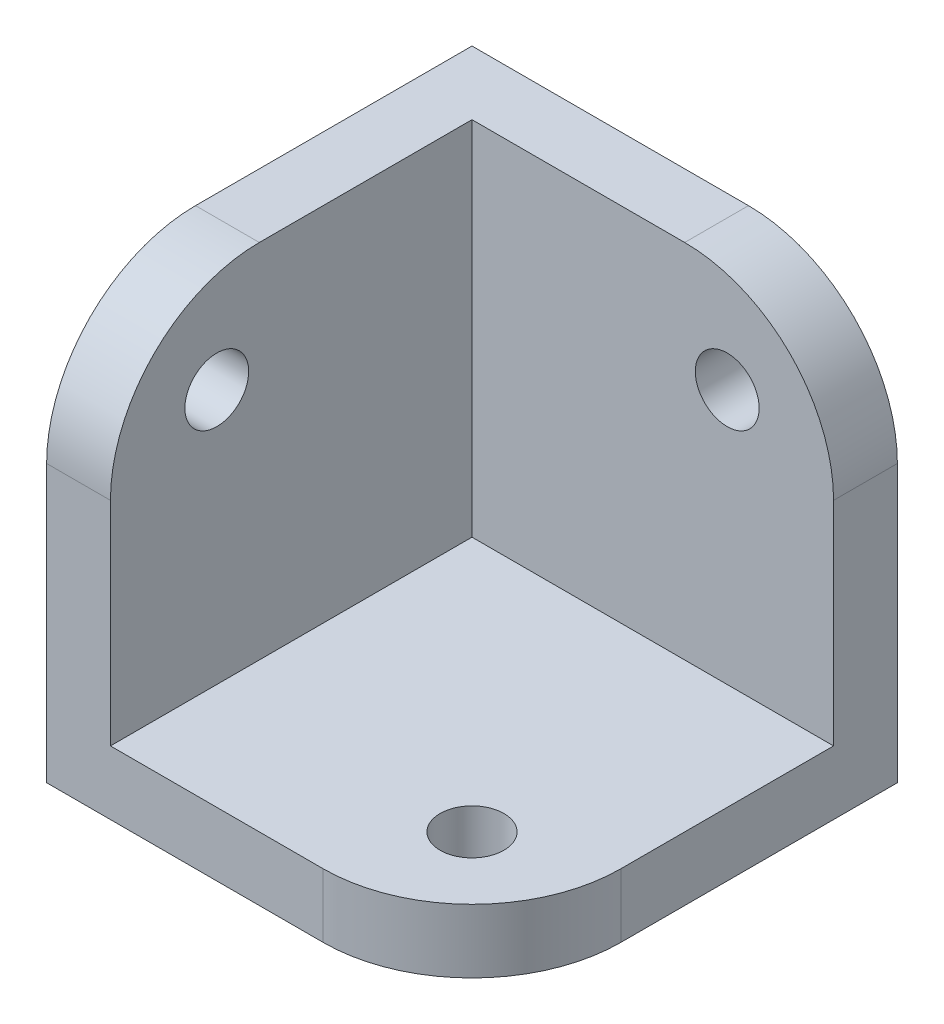
ISO-10303-21;
HEADER;
FILE_DESCRIPTION(('STEP AP214'),'2;1');
FILE_NAME('part.step','',(''),(''),'','','');
FILE_SCHEMA(('AUTOMOTIVE_DESIGN { 1 0 10303 214 1 1 1 1 }'));
ENDSEC;
DATA;
#1=APPLICATION_CONTEXT('core data for automotive mechanical design processes');
#2=APPLICATION_PROTOCOL_DEFINITION('international standard','automotive_design',2000,#1);
#3=PRODUCT_CONTEXT('',#1,'mechanical');
#4=PRODUCT('Part','Part','',(#3));
#5=PRODUCT_RELATED_PRODUCT_CATEGORY('part','',(#4));
#6=PRODUCT_DEFINITION_FORMATION('','',#4);
#7=PRODUCT_DEFINITION_CONTEXT('part definition',#1,'design');
#8=PRODUCT_DEFINITION('design','',#6,#7);
#9=PRODUCT_DEFINITION_SHAPE('','',#8);
#10=(LENGTH_UNIT() NAMED_UNIT(*) SI_UNIT(.MILLI.,.METRE.));
#11=(NAMED_UNIT(*) PLANE_ANGLE_UNIT() SI_UNIT($,.RADIAN.));
#12=(NAMED_UNIT(*) SI_UNIT($,.STERADIAN.) SOLID_ANGLE_UNIT());
#13=UNCERTAINTY_MEASURE_WITH_UNIT(LENGTH_MEASURE(1.E-05),#10,'distance_accuracy_value','');
#14=(GEOMETRIC_REPRESENTATION_CONTEXT(3) GLOBAL_UNCERTAINTY_ASSIGNED_CONTEXT((#13)) GLOBAL_UNIT_ASSIGNED_CONTEXT((#10,
#11,#12)) REPRESENTATION_CONTEXT('',''));
#15=CARTESIAN_POINT('',(0.,0.,0.));
#16=DIRECTION('',(0.,0.,1.));
#17=DIRECTION('',(1.,0.,0.));
#18=AXIS2_PLACEMENT_3D('',#15,#16,#17);
#19=CARTESIAN_POINT('',(0.,20.,3.));
#20=DIRECTION('',(1.,0.,0.));
#21=DIRECTION('',(0.,0.,-1.));
#22=AXIS2_PLACEMENT_3D('',#19,#20,#21);
#23=PLANE('',#22);
#24=CARTESIAN_POINT('',(0.,15.,15.));
#25=DIRECTION('',(-1.,0.,0.));
#26=DIRECTION('',(0.,0.,1.));
#27=AXIS2_PLACEMENT_3D('',#24,#25,#26);
#28=CIRCLE('',#27,1.5);
#29=CARTESIAN_POINT('',(0.,15.,16.5));
#30=VERTEX_POINT('',#29);
#31=EDGE_CURVE('E176',#30,#30,#28,.T.);
#32=ORIENTED_EDGE('',*,*,#31,.F.);
#33=EDGE_LOOP('',(#32));
#34=FACE_BOUND('',#33,.T.);
#35=DIRECTION('',(0.,-1.,0.));
#36=VECTOR('',#35,1.);
#37=CARTESIAN_POINT('',(0.,0.,20.));
#38=LINE('',#37,#36);
#39=CARTESIAN_POINT('',(0.,13.,20.));
#40=VERTEX_POINT('',#39);
#41=CARTESIAN_POINT('',(0.,0.,20.));
#42=VERTEX_POINT('',#41);
#43=EDGE_CURVE('E112',#40,#42,#38,.T.);
#44=ORIENTED_EDGE('',*,*,#43,.F.);
#45=CARTESIAN_POINT('',(0.,13.,13.));
#46=DIRECTION('',(1.,0.,0.));
#47=DIRECTION('',(0.,0.,-1.));
#48=AXIS2_PLACEMENT_3D('',#45,#46,#47);
#49=CIRCLE('',#48,7.);
#50=CARTESIAN_POINT('',(0.,20.,13.));
#51=VERTEX_POINT('',#50);
#52=EDGE_CURVE('E192',#40,#51,#49,.F.);
#53=ORIENTED_EDGE('',*,*,#52,.T.);
#54=DIRECTION('',(0.,0.,-1.));
#55=VECTOR('',#54,1.);
#56=CARTESIAN_POINT('',(0.,20.,3.));
#57=LINE('',#56,#55);
#58=CARTESIAN_POINT('',(0.,20.,0.));
#59=VERTEX_POINT('',#58);
#60=EDGE_CURVE('E164',#51,#59,#57,.T.);
#61=ORIENTED_EDGE('',*,*,#60,.T.);
#62=DIRECTION('',(0.,-1.,0.));
#63=VECTOR('',#62,1.);
#64=CARTESIAN_POINT('',(0.,20.,0.));
#65=LINE('',#64,#63);
#66=CARTESIAN_POINT('',(0.,0.,0.));
#67=VERTEX_POINT('',#66);
#68=EDGE_CURVE('E130',#59,#67,#65,.T.);
#69=ORIENTED_EDGE('',*,*,#68,.T.);
#70=DIRECTION('',(0.,0.,-1.));
#71=VECTOR('',#70,1.);
#72=CARTESIAN_POINT('',(0.,0.,3.));
#73=LINE('',#72,#71);
#74=EDGE_CURVE('E127',#42,#67,#73,.T.);
#75=ORIENTED_EDGE('',*,*,#74,.F.);
#76=EDGE_LOOP('',(#44,#53,#61,#69,#75));
#77=FACE_BOUND('',#76,.T.);
#78=ADVANCED_FACE('F33',(#34,#77),#23,.F.);
#79=CARTESIAN_POINT('',(0.,0.,3.));
#80=DIRECTION('',(0.,1.,0.));
#81=DIRECTION('',(0.,0.,1.));
#82=AXIS2_PLACEMENT_3D('',#79,#80,#81);
#83=PLANE('',#82);
#84=CARTESIAN_POINT('',(15.,0.,15.));
#85=DIRECTION('',(0.,-1.,0.));
#86=DIRECTION('',(0.,0.,-1.));
#87=AXIS2_PLACEMENT_3D('',#84,#85,#86);
#88=CIRCLE('',#87,1.5);
#89=CARTESIAN_POINT('',(15.,0.,13.5));
#90=VERTEX_POINT('',#89);
#91=EDGE_CURVE('E181',#90,#90,#88,.T.);
#92=ORIENTED_EDGE('',*,*,#91,.F.);
#93=EDGE_LOOP('',(#92));
#94=FACE_BOUND('',#93,.T.);
#95=DIRECTION('',(0.,0.,-1.));
#96=VECTOR('',#95,1.);
#97=CARTESIAN_POINT('',(20.,0.,3.));
#98=LINE('',#97,#96);
#99=CARTESIAN_POINT('',(20.,0.,13.));
#100=VERTEX_POINT('',#99);
#101=CARTESIAN_POINT('',(20.,0.,0.));
#102=VERTEX_POINT('',#101);
#103=EDGE_CURVE('E133',#100,#102,#98,.T.);
#104=ORIENTED_EDGE('',*,*,#103,.F.);
#105=CARTESIAN_POINT('',(13.,0.,13.));
#106=DIRECTION('',(0.,1.,0.));
#107=DIRECTION('',(0.,0.,1.));
#108=AXIS2_PLACEMENT_3D('',#105,#106,#107);
#109=CIRCLE('',#108,7.);
#110=CARTESIAN_POINT('',(13.,0.,20.));
#111=VERTEX_POINT('',#110);
#112=EDGE_CURVE('E138',#100,#111,#109,.F.);
#113=ORIENTED_EDGE('',*,*,#112,.T.);
#114=DIRECTION('',(1.,0.,0.));
#115=VECTOR('',#114,1.);
#116=CARTESIAN_POINT('',(20.,0.,20.));
#117=LINE('',#116,#115);
#118=EDGE_CURVE('E117',#42,#111,#117,.T.);
#119=ORIENTED_EDGE('',*,*,#118,.F.);
#120=ORIENTED_EDGE('',*,*,#74,.T.);
#121=DIRECTION('',(1.,0.,0.));
#122=VECTOR('',#121,1.);
#123=CARTESIAN_POINT('',(0.,0.,0.));
#124=LINE('',#123,#122);
#125=EDGE_CURVE('E166',#67,#102,#124,.T.);
#126=ORIENTED_EDGE('',*,*,#125,.T.);
#127=EDGE_LOOP('',(#104,#113,#119,#120,#126));
#128=FACE_BOUND('',#127,.T.);
#129=ADVANCED_FACE('F136',(#94,#128),#83,.F.);
#130=CARTESIAN_POINT('',(20.,0.,3.));
#131=DIRECTION('',(-1.,0.,0.));
#132=DIRECTION('',(0.,0.,1.));
#133=AXIS2_PLACEMENT_3D('',#130,#131,#132);
#134=PLANE('',#133);
#135=DIRECTION('',(0.,0.,-1.));
#136=VECTOR('',#135,1.);
#137=CARTESIAN_POINT('',(20.,3.,20.));
#138=LINE('',#137,#136);
#139=CARTESIAN_POINT('',(20.,3.,13.));
#140=VERTEX_POINT('',#139);
#141=CARTESIAN_POINT('',(20.,3.,3.));
#142=VERTEX_POINT('',#141);
#143=EDGE_CURVE('E157',#140,#142,#138,.T.);
#144=ORIENTED_EDGE('',*,*,#143,.F.);
#145=DIRECTION('',(0.,1.,0.));
#146=VECTOR('',#145,1.);
#147=CARTESIAN_POINT('',(20.,0.,13.));
#148=LINE('',#147,#146);
#149=EDGE_CURVE('E189',#140,#100,#148,.F.);
#150=ORIENTED_EDGE('',*,*,#149,.T.);
#151=ORIENTED_EDGE('',*,*,#103,.T.);
#152=DIRECTION('',(0.,1.,0.));
#153=VECTOR('',#152,1.);
#154=CARTESIAN_POINT('',(20.,0.,0.));
#155=LINE('',#154,#153);
#156=CARTESIAN_POINT('',(20.,13.,0.));
#157=VERTEX_POINT('',#156);
#158=EDGE_CURVE('E168',#102,#157,#155,.T.);
#159=ORIENTED_EDGE('',*,*,#158,.T.);
#160=DIRECTION('',(0.,0.,-1.));
#161=VECTOR('',#160,1.);
#162=CARTESIAN_POINT('',(20.,13.,3.));
#163=LINE('',#162,#161);
#164=CARTESIAN_POINT('',(20.,13.,3.));
#165=VERTEX_POINT('',#164);
#166=EDGE_CURVE('E187',#157,#165,#163,.F.);
#167=ORIENTED_EDGE('',*,*,#166,.T.);
#168=DIRECTION('',(0.,1.,0.));
#169=VECTOR('',#168,1.);
#170=CARTESIAN_POINT('',(20.,0.,3.));
#171=LINE('',#170,#169);
#172=EDGE_CURVE('E159',#142,#165,#171,.T.);
#173=ORIENTED_EDGE('',*,*,#172,.F.);
#174=EDGE_LOOP('',(#144,#150,#151,#159,#167,#173));
#175=FACE_BOUND('',#174,.T.);
#176=ADVANCED_FACE('F208',(#175),#134,.F.);
#177=CARTESIAN_POINT('',(20.,20.,3.));
#178=DIRECTION('',(0.,-1.,0.));
#179=DIRECTION('',(0.,0.,-1.));
#180=AXIS2_PLACEMENT_3D('',#177,#178,#179);
#181=PLANE('',#180);
#182=ORIENTED_EDGE('',*,*,#60,.F.);
#183=DIRECTION('',(-1.,0.,0.));
#184=VECTOR('',#183,1.);
#185=CARTESIAN_POINT('',(20.,20.,13.));
#186=LINE('',#185,#184);
#187=CARTESIAN_POINT('',(3.,20.,13.));
#188=VERTEX_POINT('',#187);
#189=EDGE_CURVE('E54',#51,#188,#186,.F.);
#190=ORIENTED_EDGE('',*,*,#189,.T.);
#191=DIRECTION('',(0.,0.,-1.));
#192=VECTOR('',#191,1.);
#193=CARTESIAN_POINT('',(3.,20.,20.));
#194=LINE('',#193,#192);
#195=CARTESIAN_POINT('',(3.,20.,3.));
#196=VERTEX_POINT('',#195);
#197=EDGE_CURVE('E146',#188,#196,#194,.T.);
#198=ORIENTED_EDGE('',*,*,#197,.T.);
#199=DIRECTION('',(-1.,0.,0.));
#200=VECTOR('',#199,1.);
#201=CARTESIAN_POINT('',(20.,20.,3.));
#202=LINE('',#201,#200);
#203=CARTESIAN_POINT('',(13.,20.,3.));
#204=VERTEX_POINT('',#203);
#205=EDGE_CURVE('E161',#204,#196,#202,.T.);
#206=ORIENTED_EDGE('',*,*,#205,.F.);
#207=DIRECTION('',(0.,0.,-1.));
#208=VECTOR('',#207,1.);
#209=CARTESIAN_POINT('',(13.,20.,3.));
#210=LINE('',#209,#208);
#211=CARTESIAN_POINT('',(13.,20.,0.));
#212=VERTEX_POINT('',#211);
#213=EDGE_CURVE('E194',#204,#212,#210,.T.);
#214=ORIENTED_EDGE('',*,*,#213,.T.);
#215=DIRECTION('',(-1.,0.,0.));
#216=VECTOR('',#215,1.);
#217=CARTESIAN_POINT('',(20.,20.,0.));
#218=LINE('',#217,#216);
#219=EDGE_CURVE('E162',#212,#59,#218,.T.);
#220=ORIENTED_EDGE('',*,*,#219,.T.);
#221=EDGE_LOOP('',(#182,#190,#198,#206,#214,#220));
#222=FACE_BOUND('',#221,.T.);
#223=ADVANCED_FACE('F210',(#222),#181,.F.);
#224=CARTESIAN_POINT('',(0.,0.,3.));
#225=DIRECTION('',(0.,0.,1.));
#226=DIRECTION('',(1.,0.,0.));
#227=AXIS2_PLACEMENT_3D('',#224,#225,#226);
#228=PLANE('',#227);
#229=CARTESIAN_POINT('',(15.,15.,3.));
#230=DIRECTION('',(0.,0.,1.));
#231=DIRECTION('',(1.,0.,0.));
#232=AXIS2_PLACEMENT_3D('',#229,#230,#231);
#233=CIRCLE('',#232,1.5);
#234=CARTESIAN_POINT('',(16.5,15.,3.));
#235=VERTEX_POINT('',#234);
#236=EDGE_CURVE('E275',#235,#235,#233,.T.);
#237=ORIENTED_EDGE('',*,*,#236,.F.);
#238=EDGE_LOOP('',(#237));
#239=FACE_BOUND('',#238,.T.);
#240=ORIENTED_EDGE('',*,*,#172,.T.);
#241=CARTESIAN_POINT('',(13.,13.,3.));
#242=DIRECTION('',(0.,0.,1.));
#243=DIRECTION('',(1.,0.,0.));
#244=AXIS2_PLACEMENT_3D('',#241,#242,#243);
#245=CIRCLE('',#244,7.);
#246=EDGE_CURVE('E11',#165,#204,#245,.T.);
#247=ORIENTED_EDGE('',*,*,#246,.T.);
#248=ORIENTED_EDGE('',*,*,#205,.T.);
#249=DIRECTION('',(0.,1.,0.));
#250=VECTOR('',#249,1.);
#251=CARTESIAN_POINT('',(3.,20.,3.));
#252=LINE('',#251,#250);
#253=CARTESIAN_POINT('',(3.,3.,3.));
#254=VERTEX_POINT('',#253);
#255=EDGE_CURVE('E123',#254,#196,#252,.T.);
#256=ORIENTED_EDGE('',*,*,#255,.F.);
#257=DIRECTION('',(-1.,0.,0.));
#258=VECTOR('',#257,1.);
#259=CARTESIAN_POINT('',(3.,3.,3.));
#260=LINE('',#259,#258);
#261=EDGE_CURVE('E147',#142,#254,#260,.T.);
#262=ORIENTED_EDGE('',*,*,#261,.F.);
#263=EDGE_LOOP('',(#240,#247,#248,#256,#262));
#264=FACE_BOUND('',#263,.T.);
#265=ADVANCED_FACE('F211',(#239,#264),#228,.T.);
#266=CARTESIAN_POINT('',(0.,0.,0.));
#267=DIRECTION('',(0.,0.,1.));
#268=DIRECTION('',(1.,0.,0.));
#269=AXIS2_PLACEMENT_3D('',#266,#267,#268);
#270=PLANE('',#269);
#271=CARTESIAN_POINT('',(15.,15.,0.));
#272=DIRECTION('',(0.,0.,-1.));
#273=DIRECTION('',(-1.,0.,0.));
#274=AXIS2_PLACEMENT_3D('',#271,#272,#273);
#275=CIRCLE('',#274,1.5);
#276=CARTESIAN_POINT('',(13.5,15.,0.));
#277=VERTEX_POINT('',#276);
#278=EDGE_CURVE('E180',#277,#277,#275,.T.);
#279=ORIENTED_EDGE('',*,*,#278,.F.);
#280=EDGE_LOOP('',(#279));
#281=FACE_BOUND('',#280,.T.);
#282=ORIENTED_EDGE('',*,*,#219,.F.);
#283=CARTESIAN_POINT('',(13.,13.,0.));
#284=DIRECTION('',(0.,0.,1.));
#285=DIRECTION('',(1.,0.,0.));
#286=AXIS2_PLACEMENT_3D('',#283,#284,#285);
#287=CIRCLE('',#286,7.);
#288=EDGE_CURVE('E41',#212,#157,#287,.F.);
#289=ORIENTED_EDGE('',*,*,#288,.T.);
#290=ORIENTED_EDGE('',*,*,#158,.F.);
#291=ORIENTED_EDGE('',*,*,#125,.F.);
#292=ORIENTED_EDGE('',*,*,#68,.F.);
#293=EDGE_LOOP('',(#282,#289,#290,#291,#292));
#294=FACE_BOUND('',#293,.T.);
#295=ADVANCED_FACE('F202',(#281,#294),#270,.F.);
#296=CARTESIAN_POINT('',(3.,3.,20.));
#297=DIRECTION('',(0.,-1.,0.));
#298=DIRECTION('',(0.,0.,-1.));
#299=AXIS2_PLACEMENT_3D('',#296,#297,#298);
#300=PLANE('',#299);
#301=CARTESIAN_POINT('',(15.,3.,15.));
#302=DIRECTION('',(0.,-1.,0.));
#303=DIRECTION('',(0.,0.,-1.));
#304=AXIS2_PLACEMENT_3D('',#301,#302,#303);
#305=CIRCLE('',#304,1.5);
#306=CARTESIAN_POINT('',(15.,3.,13.5));
#307=VERTEX_POINT('',#306);
#308=EDGE_CURVE('E177',#307,#307,#305,.T.);
#309=ORIENTED_EDGE('',*,*,#308,.T.);
#310=EDGE_LOOP('',(#309));
#311=FACE_BOUND('',#310,.T.);
#312=DIRECTION('',(-1.,0.,0.));
#313=VECTOR('',#312,1.);
#314=CARTESIAN_POINT('',(3.,3.,20.));
#315=LINE('',#314,#313);
#316=CARTESIAN_POINT('',(13.,3.,20.));
#317=VERTEX_POINT('',#316);
#318=CARTESIAN_POINT('',(3.,3.,20.));
#319=VERTEX_POINT('',#318);
#320=EDGE_CURVE('E139',#317,#319,#315,.T.);
#321=ORIENTED_EDGE('',*,*,#320,.F.);
#322=CARTESIAN_POINT('',(13.,3.,13.));
#323=DIRECTION('',(0.,-1.,0.));
#324=DIRECTION('',(0.,0.,-1.));
#325=AXIS2_PLACEMENT_3D('',#322,#323,#324);
#326=CIRCLE('',#325,7.);
#327=EDGE_CURVE('E185',#317,#140,#326,.F.);
#328=ORIENTED_EDGE('',*,*,#327,.T.);
#329=ORIENTED_EDGE('',*,*,#143,.T.);
#330=ORIENTED_EDGE('',*,*,#261,.T.);
#331=DIRECTION('',(0.,0.,-1.));
#332=VECTOR('',#331,1.);
#333=CARTESIAN_POINT('',(3.,3.,20.));
#334=LINE('',#333,#332);
#335=EDGE_CURVE('E154',#319,#254,#334,.T.);
#336=ORIENTED_EDGE('',*,*,#335,.F.);
#337=EDGE_LOOP('',(#321,#328,#329,#330,#336));
#338=FACE_BOUND('',#337,.T.);
#339=ADVANCED_FACE('F217',(#311,#338),#300,.F.);
#340=CARTESIAN_POINT('',(3.,20.,20.));
#341=DIRECTION('',(-1.,0.,0.));
#342=DIRECTION('',(0.,-1.,0.));
#343=AXIS2_PLACEMENT_3D('',#340,#341,#342);
#344=PLANE('',#343);
#345=CARTESIAN_POINT('',(3.,15.,15.));
#346=DIRECTION('',(-1.,0.,0.));
#347=DIRECTION('',(0.,-1.,0.));
#348=AXIS2_PLACEMENT_3D('',#345,#346,#347);
#349=CIRCLE('',#348,1.5);
#350=CARTESIAN_POINT('',(3.,13.5,15.));
#351=VERTEX_POINT('',#350);
#352=EDGE_CURVE('E150',#351,#351,#349,.T.);
#353=ORIENTED_EDGE('',*,*,#352,.T.);
#354=EDGE_LOOP('',(#353));
#355=FACE_BOUND('',#354,.T.);
#356=ORIENTED_EDGE('',*,*,#197,.F.);
#357=CARTESIAN_POINT('',(3.,13.,13.));
#358=DIRECTION('',(-1.,0.,0.));
#359=DIRECTION('',(0.,-1.,0.));
#360=AXIS2_PLACEMENT_3D('',#357,#358,#359);
#361=CIRCLE('',#360,7.);
#362=CARTESIAN_POINT('',(3.,13.,20.));
#363=VERTEX_POINT('',#362);
#364=EDGE_CURVE('E198',#188,#363,#361,.F.);
#365=ORIENTED_EDGE('',*,*,#364,.T.);
#366=DIRECTION('',(0.,1.,0.));
#367=VECTOR('',#366,1.);
#368=CARTESIAN_POINT('',(3.,20.,20.));
#369=LINE('',#368,#367);
#370=EDGE_CURVE('E141',#319,#363,#369,.T.);
#371=ORIENTED_EDGE('',*,*,#370,.F.);
#372=ORIENTED_EDGE('',*,*,#335,.T.);
#373=ORIENTED_EDGE('',*,*,#255,.T.);
#374=EDGE_LOOP('',(#356,#365,#371,#372,#373));
#375=FACE_BOUND('',#374,.T.);
#376=ADVANCED_FACE('F219',(#355,#375),#344,.F.);
#377=CARTESIAN_POINT('',(0.,0.,20.));
#378=DIRECTION('',(0.,0.,-1.));
#379=DIRECTION('',(-1.,0.,0.));
#380=AXIS2_PLACEMENT_3D('',#377,#378,#379);
#381=PLANE('',#380);
#382=ORIENTED_EDGE('',*,*,#118,.T.);
#383=DIRECTION('',(0.,1.,0.));
#384=VECTOR('',#383,1.);
#385=CARTESIAN_POINT('',(13.,0.,20.));
#386=LINE('',#385,#384);
#387=EDGE_CURVE('E183',#111,#317,#386,.T.);
#388=ORIENTED_EDGE('',*,*,#387,.T.);
#389=ORIENTED_EDGE('',*,*,#320,.T.);
#390=ORIENTED_EDGE('',*,*,#370,.T.);
#391=DIRECTION('',(-1.,0.,0.));
#392=VECTOR('',#391,1.);
#393=CARTESIAN_POINT('',(0.,13.,20.));
#394=LINE('',#393,#392);
#395=EDGE_CURVE('E121',#363,#40,#394,.T.);
#396=ORIENTED_EDGE('',*,*,#395,.T.);
#397=ORIENTED_EDGE('',*,*,#43,.T.);
#398=EDGE_LOOP('',(#382,#388,#389,#390,#396,#397));
#399=FACE_BOUND('',#398,.T.);
#400=ADVANCED_FACE('F114',(#399),#381,.F.);
#401=CARTESIAN_POINT('',(17.,15.,15.));
#402=DIRECTION('',(-1.,0.,0.));
#403=DIRECTION('',(0.,0.,1.));
#404=AXIS2_PLACEMENT_3D('',#401,#402,#403);
#405=CYLINDRICAL_SURFACE('',#404,1.5);
#406=ORIENTED_EDGE('',*,*,#31,.T.);
#407=EDGE_LOOP('',(#406));
#408=FACE_BOUND('',#407,.T.);
#409=ORIENTED_EDGE('',*,*,#352,.F.);
#410=EDGE_LOOP('',(#409));
#411=FACE_BOUND('',#410,.T.);
#412=ADVANCED_FACE('F264',(#408,#411),#405,.F.);
#413=CARTESIAN_POINT('',(15.,15.,17.));
#414=DIRECTION('',(0.,0.,-1.));
#415=DIRECTION('',(-1.,0.,0.));
#416=AXIS2_PLACEMENT_3D('',#413,#414,#415);
#417=CYLINDRICAL_SURFACE('',#416,1.5);
#418=ORIENTED_EDGE('',*,*,#236,.T.);
#419=EDGE_LOOP('',(#418));
#420=FACE_BOUND('',#419,.T.);
#421=ORIENTED_EDGE('',*,*,#278,.T.);
#422=EDGE_LOOP('',(#421));
#423=FACE_BOUND('',#422,.T.);
#424=ADVANCED_FACE('F233',(#420,#423),#417,.F.);
#425=CARTESIAN_POINT('',(15.,17.,15.));
#426=DIRECTION('',(0.,-1.,0.));
#427=DIRECTION('',(0.,0.,-1.));
#428=AXIS2_PLACEMENT_3D('',#425,#426,#427);
#429=CYLINDRICAL_SURFACE('',#428,1.5);
#430=ORIENTED_EDGE('',*,*,#91,.T.);
#431=EDGE_LOOP('',(#430));
#432=FACE_BOUND('',#431,.T.);
#433=ORIENTED_EDGE('',*,*,#308,.F.);
#434=EDGE_LOOP('',(#433));
#435=FACE_BOUND('',#434,.T.);
#436=ADVANCED_FACE('F227',(#432,#435),#429,.F.);
#437=CARTESIAN_POINT('',(13.,0.,13.));
#438=DIRECTION('',(0.,1.,0.));
#439=DIRECTION('',(0.,0.,1.));
#440=AXIS2_PLACEMENT_3D('',#437,#438,#439);
#441=CYLINDRICAL_SURFACE('',#440,7.);
#442=ORIENTED_EDGE('',*,*,#112,.F.);
#443=ORIENTED_EDGE('',*,*,#149,.F.);
#444=ORIENTED_EDGE('',*,*,#327,.F.);
#445=ORIENTED_EDGE('',*,*,#387,.F.);
#446=EDGE_LOOP('',(#442,#443,#444,#445));
#447=FACE_BOUND('',#446,.T.);
#448=ADVANCED_FACE('F225',(#447),#441,.T.);
#449=CARTESIAN_POINT('',(0.,13.,13.));
#450=DIRECTION('',(-1.,0.,0.));
#451=DIRECTION('',(0.,0.,1.));
#452=AXIS2_PLACEMENT_3D('',#449,#450,#451);
#453=CYLINDRICAL_SURFACE('',#452,7.);
#454=ORIENTED_EDGE('',*,*,#364,.F.);
#455=ORIENTED_EDGE('',*,*,#189,.F.);
#456=ORIENTED_EDGE('',*,*,#52,.F.);
#457=ORIENTED_EDGE('',*,*,#395,.F.);
#458=EDGE_LOOP('',(#454,#455,#456,#457));
#459=FACE_BOUND('',#458,.T.);
#460=ADVANCED_FACE('F222',(#459),#453,.T.);
#461=CARTESIAN_POINT('',(13.,13.,3.));
#462=DIRECTION('',(0.,0.,-1.));
#463=DIRECTION('',(-1.,0.,0.));
#464=AXIS2_PLACEMENT_3D('',#461,#462,#463);
#465=CYLINDRICAL_SURFACE('',#464,7.);
#466=ORIENTED_EDGE('',*,*,#246,.F.);
#467=ORIENTED_EDGE('',*,*,#166,.F.);
#468=ORIENTED_EDGE('',*,*,#288,.F.);
#469=ORIENTED_EDGE('',*,*,#213,.F.);
#470=EDGE_LOOP('',(#466,#467,#468,#469));
#471=FACE_BOUND('',#470,.T.);
#472=ADVANCED_FACE('F35',(#471),#465,.T.);
#473=CLOSED_SHELL('',(#78,#129,#176,#223,#265,#295,#339,#376,#400,#412,#424,#436,#448,#460,#472));
#474=MANIFOLD_SOLID_BREP('B2',#473);
#475=ADVANCED_BREP_SHAPE_REPRESENTATION('',(#18,#474),#14);
#476=SHAPE_DEFINITION_REPRESENTATION(#9,#475);
ENDSEC;
END-ISO-10303-21;
